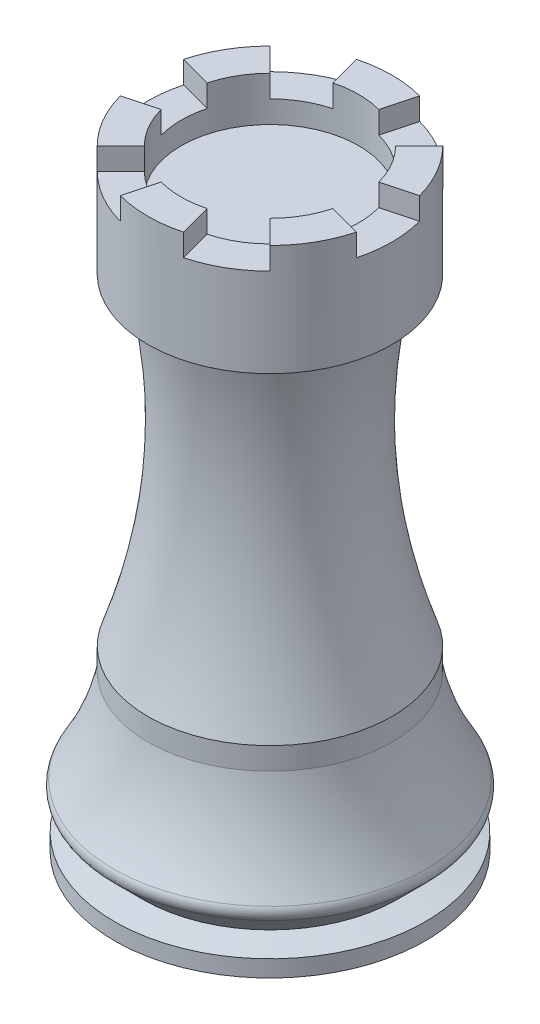
ISO-10303-21;
HEADER;
FILE_DESCRIPTION(('STEP AP214'),'2;1');
FILE_NAME('part.step','',(''),(''),'','','');
FILE_SCHEMA(('AUTOMOTIVE_DESIGN { 1 0 10303 214 1 1 1 1 }'));
ENDSEC;
DATA;
#1=APPLICATION_CONTEXT('core data for automotive mechanical design processes');
#2=APPLICATION_PROTOCOL_DEFINITION('international standard','automotive_design',2000,#1);
#3=PRODUCT_CONTEXT('',#1,'mechanical');
#4=PRODUCT('Part','Part','',(#3));
#5=PRODUCT_RELATED_PRODUCT_CATEGORY('part','',(#4));
#6=PRODUCT_DEFINITION_FORMATION('','',#4);
#7=PRODUCT_DEFINITION_CONTEXT('part definition',#1,'design');
#8=PRODUCT_DEFINITION('design','',#6,#7);
#9=PRODUCT_DEFINITION_SHAPE('','',#8);
#10=(LENGTH_UNIT() NAMED_UNIT(*) SI_UNIT(.MILLI.,.METRE.));
#11=(NAMED_UNIT(*) PLANE_ANGLE_UNIT() SI_UNIT($,.RADIAN.));
#12=(NAMED_UNIT(*) SI_UNIT($,.STERADIAN.) SOLID_ANGLE_UNIT());
#13=UNCERTAINTY_MEASURE_WITH_UNIT(LENGTH_MEASURE(1.E-05),#10,'distance_accuracy_value','');
#14=(GEOMETRIC_REPRESENTATION_CONTEXT(3) GLOBAL_UNCERTAINTY_ASSIGNED_CONTEXT((#13)) GLOBAL_UNIT_ASSIGNED_CONTEXT((#10,
#11,#12)) REPRESENTATION_CONTEXT('',''));
#15=CARTESIAN_POINT('',(0.,0.,0.));
#16=DIRECTION('',(0.,0.,1.));
#17=DIRECTION('',(1.,0.,0.));
#18=AXIS2_PLACEMENT_3D('',#15,#16,#17);
#19=CARTESIAN_POINT('',(0.,55.,0.));
#20=DIRECTION('',(0.,-1.,0.));
#21=DIRECTION('',(1.,0.,0.));
#22=AXIS2_PLACEMENT_3D('',#19,#20,#21);
#23=PLANE('',#22);
#24=DIRECTION('',(-0.707106781186556,0.,0.707106781186539));
#25=VECTOR('',#24,1.);
#26=CARTESIAN_POINT('',(7.77817459305212,55.,-7.77817459305193));
#27=LINE('',#26,#25);
#28=CARTESIAN_POINT('',(7.77817459305212,55.,-7.77817459305193));
#29=VERTEX_POINT('',#28);
#30=CARTESIAN_POINT('',(5.65685424949245,55.,-5.65685424949231));
#31=VERTEX_POINT('',#30);
#32=EDGE_CURVE('E193',#29,#31,#27,.T.);
#33=ORIENTED_EDGE('',*,*,#32,.T.);
#34=CARTESIAN_POINT('',(0.,55.,0.));
#35=DIRECTION('',(0.,1.,0.));
#36=DIRECTION('',(-1.,0.,0.));
#37=AXIS2_PLACEMENT_3D('',#34,#35,#36);
#38=CIRCLE('',#37,8.);
#39=CARTESIAN_POINT('',(7.72740661031254,55.,-2.07055236082017));
#40=VERTEX_POINT('',#39);
#41=EDGE_CURVE('E307',#40,#31,#38,.T.);
#42=ORIENTED_EDGE('',*,*,#41,.F.);
#43=DIRECTION('',(-0.965925826289068,0.,0.258819045102521));
#44=VECTOR('',#43,1.);
#45=CARTESIAN_POINT('',(10.6251840891797,55.,-2.84700949612773));
#46=LINE('',#45,#44);
#47=CARTESIAN_POINT('',(10.6251840891797,55.,-2.84700949612773));
#48=VERTEX_POINT('',#47);
#49=EDGE_CURVE('E216',#48,#40,#46,.T.);
#50=ORIENTED_EDGE('',*,*,#49,.F.);
#51=CARTESIAN_POINT('',(0.,55.,0.));
#52=DIRECTION('',(0.,1.,0.));
#53=DIRECTION('',(-1.,0.,0.));
#54=AXIS2_PLACEMENT_3D('',#51,#52,#53);
#55=CIRCLE('',#54,11.);
#56=EDGE_CURVE('E211',#48,#29,#55,.T.);
#57=ORIENTED_EDGE('',*,*,#56,.T.);
#58=EDGE_LOOP('',(#33,#42,#50,#57));
#59=FACE_BOUND('',#58,.T.);
#60=ADVANCED_FACE('F33',(#59),#23,.F.);
#61=CARTESIAN_POINT('',(2.07055236082025,55.,-7.72740661031252));
#62=VERTEX_POINT('',#61);
#63=CARTESIAN_POINT('',(-2.07055236082009,55.,-7.72740661031257));
#64=VERTEX_POINT('',#63);
#65=EDGE_CURVE('E300',#62,#64,#38,.T.);
#66=ORIENTED_EDGE('',*,*,#65,.F.);
#67=DIRECTION('',(-0.258819045102532,0.,0.965925826289065));
#68=VECTOR('',#67,1.);
#69=CARTESIAN_POINT('',(2.84700949612785,55.,-10.6251840891797));
#70=LINE('',#69,#68);
#71=CARTESIAN_POINT('',(2.84700949612785,55.,-10.6251840891797));
#72=VERTEX_POINT('',#71);
#73=EDGE_CURVE('E301',#72,#62,#70,.T.);
#74=ORIENTED_EDGE('',*,*,#73,.F.);
#75=CARTESIAN_POINT('',(-2.84700949612762,55.,-10.6251840891798));
#76=VERTEX_POINT('',#75);
#77=EDGE_CURVE('E217',#72,#76,#55,.T.);
#78=ORIENTED_EDGE('',*,*,#77,.T.);
#79=DIRECTION('',(0.258819045102511,0.,0.965925826289071));
#80=VECTOR('',#79,1.);
#81=CARTESIAN_POINT('',(-2.84700949612762,55.,-10.6251840891798));
#82=LINE('',#81,#80);
#83=EDGE_CURVE('E303',#76,#64,#82,.T.);
#84=ORIENTED_EDGE('',*,*,#83,.T.);
#85=EDGE_LOOP('',(#66,#74,#78,#84));
#86=FACE_BOUND('',#85,.T.);
#87=ADVANCED_FACE('F287',(#86),#23,.F.);
#88=CARTESIAN_POINT('',(-5.65685424949233,55.,-5.65685424949243));
#89=VERTEX_POINT('',#88);
#90=CARTESIAN_POINT('',(-7.72740661031255,55.,-2.07055236082017));
#91=VERTEX_POINT('',#90);
#92=EDGE_CURVE('E308',#89,#91,#38,.T.);
#93=ORIENTED_EDGE('',*,*,#92,.F.);
#94=DIRECTION('',(0.707106781186541,0.,0.707106781186554));
#95=VECTOR('',#94,1.);
#96=CARTESIAN_POINT('',(-7.77817459305195,55.,-7.77817459305209));
#97=LINE('',#96,#95);
#98=CARTESIAN_POINT('',(-7.77817459305195,55.,-7.77817459305209));
#99=VERTEX_POINT('',#98);
#100=EDGE_CURVE('E426',#99,#89,#97,.T.);
#101=ORIENTED_EDGE('',*,*,#100,.F.);
#102=CARTESIAN_POINT('',(-10.6251840891797,55.,-2.84700949612773));
#103=VERTEX_POINT('',#102);
#104=EDGE_CURVE('E221',#99,#103,#55,.T.);
#105=ORIENTED_EDGE('',*,*,#104,.T.);
#106=DIRECTION('',(0.965925826289068,0.,0.258819045102521));
#107=VECTOR('',#106,1.);
#108=CARTESIAN_POINT('',(-10.6251840891797,55.,-2.84700949612773));
#109=LINE('',#108,#107);
#110=EDGE_CURVE('E410',#103,#91,#109,.T.);
#111=ORIENTED_EDGE('',*,*,#110,.T.);
#112=EDGE_LOOP('',(#93,#101,#105,#111));
#113=FACE_BOUND('',#112,.T.);
#114=ADVANCED_FACE('F291',(#113),#23,.F.);
#115=CARTESIAN_POINT('',(-7.72740661031255,55.,2.07055236082017));
#116=VERTEX_POINT('',#115);
#117=CARTESIAN_POINT('',(-5.65685424949241,55.,5.65685424949235));
#118=VERTEX_POINT('',#117);
#119=EDGE_CURVE('E310',#116,#118,#38,.T.);
#120=ORIENTED_EDGE('',*,*,#119,.F.);
#121=DIRECTION('',(0.965925826289068,0.,-0.258819045102521));
#122=VECTOR('',#121,1.);
#123=CARTESIAN_POINT('',(-10.6251840891797,55.,2.84700949612773));
#124=LINE('',#123,#122);
#125=CARTESIAN_POINT('',(-10.6251840891797,55.,2.84700949612773));
#126=VERTEX_POINT('',#125);
#127=EDGE_CURVE('E401',#126,#116,#124,.T.);
#128=ORIENTED_EDGE('',*,*,#127,.F.);
#129=CARTESIAN_POINT('',(-7.77817459305206,55.,7.77817459305198));
#130=VERTEX_POINT('',#129);
#131=EDGE_CURVE('E230',#126,#130,#55,.T.);
#132=ORIENTED_EDGE('',*,*,#131,.T.);
#133=DIRECTION('',(0.707106781186551,0.,-0.707106781186544));
#134=VECTOR('',#133,1.);
#135=CARTESIAN_POINT('',(-7.77817459305206,55.,7.77817459305198));
#136=LINE('',#135,#134);
#137=EDGE_CURVE('E384',#130,#118,#136,.T.);
#138=ORIENTED_EDGE('',*,*,#137,.T.);
#139=EDGE_LOOP('',(#120,#128,#132,#138));
#140=FACE_BOUND('',#139,.T.);
#141=ADVANCED_FACE('F283',(#140),#23,.F.);
#142=CARTESIAN_POINT('',(-2.0705523608202,55.,7.72740661031254));
#143=VERTEX_POINT('',#142);
#144=CARTESIAN_POINT('',(2.07055236082014,55.,7.72740661031255));
#145=VERTEX_POINT('',#144);
#146=EDGE_CURVE('E464',#143,#145,#38,.T.);
#147=ORIENTED_EDGE('',*,*,#146,.F.);
#148=DIRECTION('',(0.258819045102525,0.,-0.965925826289067));
#149=VECTOR('',#148,1.);
#150=CARTESIAN_POINT('',(-2.84700949612777,55.,10.6251840891797));
#151=LINE('',#150,#149);
#152=CARTESIAN_POINT('',(-2.84700949612777,55.,10.6251840891797));
#153=VERTEX_POINT('',#152);
#154=EDGE_CURVE('E375',#153,#143,#151,.T.);
#155=ORIENTED_EDGE('',*,*,#154,.F.);
#156=CARTESIAN_POINT('',(2.8470094961277,55.,10.6251840891798));
#157=VERTEX_POINT('',#156);
#158=EDGE_CURVE('E223',#153,#157,#55,.T.);
#159=ORIENTED_EDGE('',*,*,#158,.T.);
#160=DIRECTION('',(-0.258819045102518,0.,-0.965925826289069));
#161=VECTOR('',#160,1.);
#162=CARTESIAN_POINT('',(2.8470094961277,55.,10.6251840891798));
#163=LINE('',#162,#161);
#164=EDGE_CURVE('E358',#157,#145,#163,.T.);
#165=ORIENTED_EDGE('',*,*,#164,.T.);
#166=EDGE_LOOP('',(#147,#155,#159,#165));
#167=FACE_BOUND('',#166,.T.);
#168=ADVANCED_FACE('F279',(#167),#23,.F.);
#169=CARTESIAN_POINT('',(5.65685424949237,55.,5.65685424949239));
#170=VERTEX_POINT('',#169);
#171=CARTESIAN_POINT('',(7.72740661031254,55.,2.07055236082017));
#172=VERTEX_POINT('',#171);
#173=EDGE_CURVE('E309',#170,#172,#38,.T.);
#174=ORIENTED_EDGE('',*,*,#173,.F.);
#175=DIRECTION('',(-0.707106781186546,0.,-0.707106781186549));
#176=VECTOR('',#175,1.);
#177=CARTESIAN_POINT('',(7.77817459305201,55.,7.77817459305203));
#178=LINE('',#177,#176);
#179=CARTESIAN_POINT('',(7.77817459305201,55.,7.77817459305203));
#180=VERTEX_POINT('',#179);
#181=EDGE_CURVE('E349',#180,#170,#178,.T.);
#182=ORIENTED_EDGE('',*,*,#181,.F.);
#183=CARTESIAN_POINT('',(10.6251840891797,55.,2.84700949612773));
#184=VERTEX_POINT('',#183);
#185=EDGE_CURVE('E219',#180,#184,#55,.T.);
#186=ORIENTED_EDGE('',*,*,#185,.T.);
#187=DIRECTION('',(-0.965925826289068,0.,-0.258819045102521));
#188=VECTOR('',#187,1.);
#189=CARTESIAN_POINT('',(10.6251840891797,55.,2.84700949612773));
#190=LINE('',#189,#188);
#191=EDGE_CURVE('E333',#184,#172,#190,.T.);
#192=ORIENTED_EDGE('',*,*,#191,.T.);
#193=EDGE_LOOP('',(#174,#182,#186,#192));
#194=FACE_BOUND('',#193,.T.);
#195=ADVANCED_FACE('F277',(#194),#23,.F.);
#196=CARTESIAN_POINT('',(0.,55.,0.));
#197=DIRECTION('',(0.,1.,0.));
#198=DIRECTION('',(-1.,0.,0.));
#199=AXIS2_PLACEMENT_3D('',#196,#197,#198);
#200=CYLINDRICAL_SURFACE('',#199,11.);
#201=ORIENTED_EDGE('',*,*,#77,.F.);
#202=DIRECTION('',(0.,1.,0.));
#203=VECTOR('',#202,1.);
#204=CARTESIAN_POINT('',(2.84700949612785,55.,-10.6251840891797));
#205=LINE('',#204,#203);
#206=CARTESIAN_POINT('',(2.84700949612785,53.,-10.6251840891797));
#207=VERTEX_POINT('',#206);
#208=EDGE_CURVE('E446',#207,#72,#205,.T.);
#209=ORIENTED_EDGE('',*,*,#208,.F.);
#210=CARTESIAN_POINT('',(0.,53.,0.));
#211=DIRECTION('',(0.,-1.,0.));
#212=DIRECTION('',(-0.866025403784433,0.,-0.50000000000001));
#213=AXIS2_PLACEMENT_3D('',#210,#211,#212);
#214=CIRCLE('',#213,11.);
#215=CARTESIAN_POINT('',(7.77817459305212,53.,-7.77817459305193));
#216=VERTEX_POINT('',#215);
#217=EDGE_CURVE('E213',#207,#216,#214,.T.);
#218=ORIENTED_EDGE('',*,*,#217,.T.);
#219=DIRECTION('',(0.,1.,0.));
#220=VECTOR('',#219,1.);
#221=CARTESIAN_POINT('',(7.77817459305212,55.,-7.77817459305193));
#222=LINE('',#221,#220);
#223=EDGE_CURVE('E196',#216,#29,#222,.T.);
#224=ORIENTED_EDGE('',*,*,#223,.T.);
#225=ORIENTED_EDGE('',*,*,#56,.F.);
#226=DIRECTION('',(0.,1.,0.));
#227=VECTOR('',#226,1.);
#228=CARTESIAN_POINT('',(10.6251840891797,55.,-2.84700949612773));
#229=LINE('',#228,#227);
#230=CARTESIAN_POINT('',(10.6251840891797,53.,-2.84700949612773));
#231=VERTEX_POINT('',#230);
#232=EDGE_CURVE('E326',#231,#48,#229,.T.);
#233=ORIENTED_EDGE('',*,*,#232,.F.);
#234=CARTESIAN_POINT('',(0.,53.,0.));
#235=DIRECTION('',(0.,-1.,0.));
#236=DIRECTION('',(0.,0.,-1.));
#237=AXIS2_PLACEMENT_3D('',#234,#235,#236);
#238=CIRCLE('',#237,11.);
#239=CARTESIAN_POINT('',(10.6251840891797,53.,2.84700949612773));
#240=VERTEX_POINT('',#239);
#241=EDGE_CURVE('E314',#231,#240,#238,.T.);
#242=ORIENTED_EDGE('',*,*,#241,.T.);
#243=DIRECTION('',(0.,1.,0.));
#244=VECTOR('',#243,1.);
#245=CARTESIAN_POINT('',(10.6251840891797,55.,2.84700949612773));
#246=LINE('',#245,#244);
#247=EDGE_CURVE('E335',#240,#184,#246,.T.);
#248=ORIENTED_EDGE('',*,*,#247,.T.);
#249=ORIENTED_EDGE('',*,*,#185,.F.);
#250=DIRECTION('',(0.,1.,0.));
#251=VECTOR('',#250,1.);
#252=CARTESIAN_POINT('',(7.77817459305201,55.,7.77817459305203));
#253=LINE('',#252,#251);
#254=CARTESIAN_POINT('',(7.77817459305201,53.,7.77817459305203));
#255=VERTEX_POINT('',#254);
#256=EDGE_CURVE('E351',#255,#180,#253,.T.);
#257=ORIENTED_EDGE('',*,*,#256,.F.);
#258=CARTESIAN_POINT('',(0.,53.,0.));
#259=DIRECTION('',(0.,-1.,0.));
#260=DIRECTION('',(0.86602540378444,0.,-0.499999999999998));
#261=AXIS2_PLACEMENT_3D('',#258,#259,#260);
#262=CIRCLE('',#261,11.);
#263=CARTESIAN_POINT('',(2.8470094961277,53.,10.6251840891798));
#264=VERTEX_POINT('',#263);
#265=EDGE_CURVE('E338',#255,#264,#262,.T.);
#266=ORIENTED_EDGE('',*,*,#265,.T.);
#267=DIRECTION('',(0.,1.,0.));
#268=VECTOR('',#267,1.);
#269=CARTESIAN_POINT('',(2.8470094961277,55.,10.6251840891798));
#270=LINE('',#269,#268);
#271=EDGE_CURVE('E361',#264,#157,#270,.T.);
#272=ORIENTED_EDGE('',*,*,#271,.T.);
#273=ORIENTED_EDGE('',*,*,#158,.F.);
#274=DIRECTION('',(0.,1.,0.));
#275=VECTOR('',#274,1.);
#276=CARTESIAN_POINT('',(-2.84700949612777,55.,10.6251840891797));
#277=LINE('',#276,#275);
#278=CARTESIAN_POINT('',(-2.84700949612777,53.,10.6251840891797));
#279=VERTEX_POINT('',#278);
#280=EDGE_CURVE('E377',#279,#153,#277,.T.);
#281=ORIENTED_EDGE('',*,*,#280,.F.);
#282=CARTESIAN_POINT('',(0.,53.,0.));
#283=DIRECTION('',(0.,-1.,0.));
#284=DIRECTION('',(0.866025403784436,0.,0.500000000000004));
#285=AXIS2_PLACEMENT_3D('',#282,#283,#284);
#286=CIRCLE('',#285,11.);
#287=CARTESIAN_POINT('',(-7.77817459305206,53.,7.77817459305198));
#288=VERTEX_POINT('',#287);
#289=EDGE_CURVE('E364',#279,#288,#286,.T.);
#290=ORIENTED_EDGE('',*,*,#289,.T.);
#291=DIRECTION('',(0.,1.,0.));
#292=VECTOR('',#291,1.);
#293=CARTESIAN_POINT('',(-7.77817459305206,55.,7.77817459305198));
#294=LINE('',#293,#292);
#295=EDGE_CURVE('E387',#288,#130,#294,.T.);
#296=ORIENTED_EDGE('',*,*,#295,.T.);
#297=ORIENTED_EDGE('',*,*,#131,.F.);
#298=DIRECTION('',(0.,1.,0.));
#299=VECTOR('',#298,1.);
#300=CARTESIAN_POINT('',(-10.6251840891797,55.,2.84700949612773));
#301=LINE('',#300,#299);
#302=CARTESIAN_POINT('',(-10.6251840891797,53.,2.84700949612773));
#303=VERTEX_POINT('',#302);
#304=EDGE_CURVE('E403',#303,#126,#301,.T.);
#305=ORIENTED_EDGE('',*,*,#304,.F.);
#306=CARTESIAN_POINT('',(0.,53.,0.));
#307=DIRECTION('',(0.,-1.,0.));
#308=DIRECTION('',(0.,0.,1.));
#309=AXIS2_PLACEMENT_3D('',#306,#307,#308);
#310=CIRCLE('',#309,11.);
#311=CARTESIAN_POINT('',(-10.6251840891797,53.,-2.84700949612773));
#312=VERTEX_POINT('',#311);
#313=EDGE_CURVE('E390',#303,#312,#310,.T.);
#314=ORIENTED_EDGE('',*,*,#313,.T.);
#315=DIRECTION('',(0.,1.,0.));
#316=VECTOR('',#315,1.);
#317=CARTESIAN_POINT('',(-10.6251840891797,55.,-2.84700949612773));
#318=LINE('',#317,#316);
#319=EDGE_CURVE('E413',#312,#103,#318,.T.);
#320=ORIENTED_EDGE('',*,*,#319,.T.);
#321=ORIENTED_EDGE('',*,*,#104,.F.);
#322=DIRECTION('',(0.,1.,0.));
#323=VECTOR('',#322,1.);
#324=CARTESIAN_POINT('',(-7.77817459305195,55.,-7.77817459305209));
#325=LINE('',#324,#323);
#326=CARTESIAN_POINT('',(-7.77817459305195,53.,-7.77817459305209));
#327=VERTEX_POINT('',#326);
#328=EDGE_CURVE('E428',#327,#99,#325,.T.);
#329=ORIENTED_EDGE('',*,*,#328,.F.);
#330=CARTESIAN_POINT('',(0.,53.,0.));
#331=DIRECTION('',(0.,-1.,0.));
#332=DIRECTION('',(-0.866025403784443,0.,0.499999999999992));
#333=AXIS2_PLACEMENT_3D('',#330,#331,#332);
#334=CIRCLE('',#333,11.);
#335=CARTESIAN_POINT('',(-2.84700949612762,53.,-10.6251840891798));
#336=VERTEX_POINT('',#335);
#337=EDGE_CURVE('E416',#327,#336,#334,.T.);
#338=ORIENTED_EDGE('',*,*,#337,.T.);
#339=DIRECTION('',(0.,1.,0.));
#340=VECTOR('',#339,1.);
#341=CARTESIAN_POINT('',(-2.84700949612762,55.,-10.6251840891798));
#342=LINE('',#341,#340);
#343=EDGE_CURVE('E434',#336,#76,#342,.T.);
#344=ORIENTED_EDGE('',*,*,#343,.T.);
#345=EDGE_LOOP('',(#201,#209,#218,#224,#225,#233,#242,#248,#249,#257,#266,#272,#273,#281,#290,
#296,#297,#305,#314,#320,#321,#329,#338,#344));
#346=FACE_BOUND('',#345,.T.);
#347=CARTESIAN_POINT('',(0.,45.,0.));
#348=DIRECTION('',(0.,1.,0.));
#349=DIRECTION('',(-1.,0.,0.));
#350=AXIS2_PLACEMENT_3D('',#347,#348,#349);
#351=CIRCLE('',#350,11.);
#352=CARTESIAN_POINT('',(-11.,45.,0.));
#353=VERTEX_POINT('',#352);
#354=EDGE_CURVE('E224',#353,#353,#351,.T.);
#355=ORIENTED_EDGE('',*,*,#354,.T.);
#356=EDGE_LOOP('',(#355));
#357=FACE_BOUND('',#356,.T.);
#358=ADVANCED_FACE('F208',(#346,#357),#200,.T.);
#359=CARTESIAN_POINT('',(0.,44.,0.));
#360=DIRECTION('',(0.,1.,0.));
#361=DIRECTION('',(-1.,0.,0.));
#362=AXIS2_PLACEMENT_3D('',#359,#360,#361);
#363=CONICAL_SURFACE('',#362,9.,1.10714871779409);
#364=ORIENTED_EDGE('',*,*,#354,.F.);
#365=EDGE_LOOP('',(#364));
#366=FACE_BOUND('',#365,.T.);
#367=CARTESIAN_POINT('',(0.,44.,0.));
#368=DIRECTION('',(0.,1.,0.));
#369=DIRECTION('',(-1.,0.,0.));
#370=AXIS2_PLACEMENT_3D('',#367,#368,#369);
#371=CIRCLE('',#370,9.);
#372=CARTESIAN_POINT('',(-9.,44.,0.));
#373=VERTEX_POINT('',#372);
#374=EDGE_CURVE('E232',#373,#373,#371,.T.);
#375=ORIENTED_EDGE('',*,*,#374,.T.);
#376=EDGE_LOOP('',(#375));
#377=FACE_BOUND('',#376,.T.);
#378=ADVANCED_FACE('F270',(#366,#377),#363,.T.);
#379=CARTESIAN_POINT('',(11.,16.,0.));
#380=CARTESIAN_POINT('',(6.11915337363332,30.1600712777124,0.));
#381=CARTESIAN_POINT('',(9.,44.,0.));
#382=B_SPLINE_CURVE_WITH_KNOTS('',2,(#379,#380,#381),.UNSPECIFIED.,.F.,.F.,(3,3),(0.,1.),.UNSPECIFIED.);
#383=CARTESIAN_POINT('',(0.,55.,0.));
#384=DIRECTION('',(0.,1.,0.));
#385=AXIS1_PLACEMENT('',#383,#384);
#386=SURFACE_OF_REVOLUTION('',#382,#385);
#387=ORIENTED_EDGE('',*,*,#374,.F.);
#388=EDGE_LOOP('',(#387));
#389=FACE_BOUND('',#388,.T.);
#390=CARTESIAN_POINT('',(0.,16.,0.));
#391=DIRECTION('',(0.,1.,0.));
#392=DIRECTION('',(-1.,0.,0.));
#393=AXIS2_PLACEMENT_3D('',#390,#391,#392);
#394=CIRCLE('',#393,11.);
#395=CARTESIAN_POINT('',(-11.,16.,0.));
#396=VERTEX_POINT('',#395);
#397=EDGE_CURVE('E235',#396,#396,#394,.T.);
#398=ORIENTED_EDGE('',*,*,#397,.T.);
#399=EDGE_LOOP('',(#398));
#400=FACE_BOUND('',#399,.T.);
#401=ADVANCED_FACE('F265',(#389,#400),#386,.T.);
#402=CARTESIAN_POINT('',(0.,55.,0.));
#403=DIRECTION('',(0.,1.,0.));
#404=DIRECTION('',(-1.,0.,0.));
#405=AXIS2_PLACEMENT_3D('',#402,#403,#404);
#406=CYLINDRICAL_SURFACE('',#405,11.);
#407=ORIENTED_EDGE('',*,*,#397,.F.);
#408=EDGE_LOOP('',(#407));
#409=FACE_BOUND('',#408,.T.);
#410=CARTESIAN_POINT('',(0.,14.,0.));
#411=DIRECTION('',(0.,1.,0.));
#412=DIRECTION('',(-1.,0.,0.));
#413=AXIS2_PLACEMENT_3D('',#410,#411,#412);
#414=CIRCLE('',#413,11.);
#415=CARTESIAN_POINT('',(-11.,14.,0.));
#416=VERTEX_POINT('',#415);
#417=EDGE_CURVE('E240',#416,#416,#414,.T.);
#418=ORIENTED_EDGE('',*,*,#417,.T.);
#419=EDGE_LOOP('',(#418));
#420=FACE_BOUND('',#419,.T.);
#421=ADVANCED_FACE('F269',(#409,#420),#406,.T.);
#422=CARTESIAN_POINT('',(14.5,5.,0.));
#423=CARTESIAN_POINT('',(11.8688971181247,9.1496313389872,0.));
#424=CARTESIAN_POINT('',(11.,14.,0.));
#425=B_SPLINE_CURVE_WITH_KNOTS('',2,(#422,#423,#424),.UNSPECIFIED.,.F.,.F.,(3,3),(0.,1.),.UNSPECIFIED.);
#426=CARTESIAN_POINT('',(0.,55.,0.));
#427=DIRECTION('',(0.,1.,0.));
#428=AXIS1_PLACEMENT('',#426,#427);
#429=SURFACE_OF_REVOLUTION('',#425,#428);
#430=CARTESIAN_POINT('',(0.,5.65941289420462,0.));
#431=DIRECTION('',(0.,1.,0.));
#432=DIRECTION('',(-1.,0.,0.));
#433=AXIS2_PLACEMENT_3D('',#430,#431,#432);
#434=CIRCLE('',#433,14.0956405231006);
#435=CARTESIAN_POINT('',(-14.0956405231006,5.65941289420462,0.));
#436=VERTEX_POINT('',#435);
#437=EDGE_CURVE('E41',#436,#436,#434,.T.);
#438=ORIENTED_EDGE('',*,*,#437,.T.);
#439=EDGE_LOOP('',(#438));
#440=FACE_BOUND('',#439,.T.);
#441=ORIENTED_EDGE('',*,*,#417,.F.);
#442=EDGE_LOOP('',(#441));
#443=FACE_BOUND('',#442,.T.);
#444=ADVANCED_FACE('F555',(#440,#443),#429,.T.);
#445=CARTESIAN_POINT('',(0.,1.94968869268542,0.));
#446=DIRECTION('',(0.,1.,0.));
#447=DIRECTION('',(-1.,0.,0.));
#448=AXIS2_PLACEMENT_3D('',#445,#446,#447);
#449=CONICAL_SURFACE('',#448,11.4496886926854,0.785398163397447);
#450=CARTESIAN_POINT('',(0.,4.44247361372824,0.));
#451=DIRECTION('',(0.,-1.,0.));
#452=DIRECTION('',(1.,0.,0.));
#453=AXIS2_PLACEMENT_3D('',#450,#451,#452);
#454=CIRCLE('',#453,13.9424736137282);
#455=CARTESIAN_POINT('',(13.9424736137282,4.44247361372824,0.));
#456=VERTEX_POINT('',#455);
#457=EDGE_CURVE('E11',#456,#456,#454,.T.);
#458=ORIENTED_EDGE('',*,*,#457,.T.);
#459=EDGE_LOOP('',(#458));
#460=FACE_BOUND('',#459,.T.);
#461=CARTESIAN_POINT('',(0.,1.94968869268542,0.));
#462=DIRECTION('',(0.,1.,0.));
#463=DIRECTION('',(-1.,0.,0.));
#464=AXIS2_PLACEMENT_3D('',#461,#462,#463);
#465=CIRCLE('',#464,11.4496886926854);
#466=CARTESIAN_POINT('',(-11.4496886926854,1.94968869268542,0.));
#467=VERTEX_POINT('',#466);
#468=EDGE_CURVE('E243',#467,#467,#465,.T.);
#469=ORIENTED_EDGE('',*,*,#468,.T.);
#470=EDGE_LOOP('',(#469));
#471=FACE_BOUND('',#470,.T.);
#472=ADVANCED_FACE('F552',(#460,#471),#449,.T.);
#473=CARTESIAN_POINT('',(0.,1.5,0.));
#474=DIRECTION('',(0.,-1.,0.));
#475=DIRECTION('',(1.,0.,0.));
#476=AXIS2_PLACEMENT_3D('',#473,#474,#475);
#477=CONICAL_SURFACE('',#476,14.,1.39626340159547);
#478=ORIENTED_EDGE('',*,*,#468,.F.);
#479=EDGE_LOOP('',(#478));
#480=FACE_BOUND('',#479,.T.);
#481=CARTESIAN_POINT('',(0.,1.5,0.));
#482=DIRECTION('',(0.,1.,0.));
#483=DIRECTION('',(-1.,0.,0.));
#484=AXIS2_PLACEMENT_3D('',#481,#482,#483);
#485=CIRCLE('',#484,14.);
#486=CARTESIAN_POINT('',(-14.,1.5,0.));
#487=VERTEX_POINT('',#486);
#488=EDGE_CURVE('E246',#487,#487,#485,.T.);
#489=ORIENTED_EDGE('',*,*,#488,.T.);
#490=EDGE_LOOP('',(#489));
#491=FACE_BOUND('',#490,.T.);
#492=ADVANCED_FACE('F548',(#480,#491),#477,.T.);
#493=CARTESIAN_POINT('',(0.,55.,0.));
#494=DIRECTION('',(0.,1.,0.));
#495=DIRECTION('',(-1.,0.,0.));
#496=AXIS2_PLACEMENT_3D('',#493,#494,#495);
#497=CYLINDRICAL_SURFACE('',#496,14.);
#498=ORIENTED_EDGE('',*,*,#488,.F.);
#499=EDGE_LOOP('',(#498));
#500=FACE_BOUND('',#499,.T.);
#501=CARTESIAN_POINT('',(0.,0.,0.));
#502=DIRECTION('',(0.,1.,0.));
#503=DIRECTION('',(-1.,0.,0.));
#504=AXIS2_PLACEMENT_3D('',#501,#502,#503);
#505=CIRCLE('',#504,14.);
#506=CARTESIAN_POINT('',(-14.,0.,0.));
#507=VERTEX_POINT('',#506);
#508=EDGE_CURVE('E249',#507,#507,#505,.T.);
#509=ORIENTED_EDGE('',*,*,#508,.T.);
#510=EDGE_LOOP('',(#509));
#511=FACE_BOUND('',#510,.T.);
#512=ADVANCED_FACE('F544',(#500,#511),#497,.T.);
#513=CARTESIAN_POINT('',(0.,0.,0.));
#514=DIRECTION('',(0.,1.,0.));
#515=DIRECTION('',(-1.,0.,0.));
#516=AXIS2_PLACEMENT_3D('',#513,#514,#515);
#517=PLANE('',#516);
#518=ORIENTED_EDGE('',*,*,#508,.F.);
#519=EDGE_LOOP('',(#518));
#520=FACE_BOUND('',#519,.T.);
#521=ADVANCED_FACE('F541',(#520),#517,.F.);
#522=CARTESIAN_POINT('',(0.,5.14958039491478,0.));
#523=DIRECTION('',(0.,-1.,0.));
#524=DIRECTION('',(1.,0.,0.));
#525=AXIS2_PLACEMENT_3D('',#522,#523,#524);
#526=TOROIDAL_SURFACE('',#525,13.2353668325417,1.);
#527=ORIENTED_EDGE('',*,*,#457,.F.);
#528=EDGE_LOOP('',(#527));
#529=FACE_BOUND('',#528,.T.);
#530=ORIENTED_EDGE('',*,*,#437,.F.);
#531=EDGE_LOOP('',(#530));
#532=FACE_BOUND('',#531,.T.);
#533=ADVANCED_FACE('F35',(#529,#532),#526,.T.);
#534=CARTESIAN_POINT('',(0.,51.,0.));
#535=DIRECTION('',(0.,1.,0.));
#536=DIRECTION('',(-1.,0.,0.));
#537=AXIS2_PLACEMENT_3D('',#534,#535,#536);
#538=CYLINDRICAL_SURFACE('',#537,8.);
#539=CARTESIAN_POINT('',(0.,51.,0.));
#540=DIRECTION('',(0.,1.,0.));
#541=DIRECTION('',(-1.,0.,0.));
#542=AXIS2_PLACEMENT_3D('',#539,#540,#541);
#543=CIRCLE('',#542,8.);
#544=CARTESIAN_POINT('',(-8.,51.,0.));
#545=VERTEX_POINT('',#544);
#546=EDGE_CURVE('E252',#545,#545,#543,.T.);
#547=ORIENTED_EDGE('',*,*,#546,.F.);
#548=EDGE_LOOP('',(#547));
#549=FACE_BOUND('',#548,.T.);
#550=CARTESIAN_POINT('',(0.,53.,0.));
#551=DIRECTION('',(0.,-1.,0.));
#552=DIRECTION('',(-0.866025403784433,0.,-0.50000000000001));
#553=AXIS2_PLACEMENT_3D('',#550,#551,#552);
#554=CIRCLE('',#553,8.);
#555=CARTESIAN_POINT('',(2.07055236082025,53.,-7.72740661031252));
#556=VERTEX_POINT('',#555);
#557=CARTESIAN_POINT('',(5.65685424949245,53.,-5.65685424949231));
#558=VERTEX_POINT('',#557);
#559=EDGE_CURVE('E438',#556,#558,#554,.T.);
#560=ORIENTED_EDGE('',*,*,#559,.F.);
#561=DIRECTION('',(0.,-1.,0.));
#562=VECTOR('',#561,1.);
#563=CARTESIAN_POINT('',(2.07055236082025,55.,-7.72740661031252));
#564=LINE('',#563,#562);
#565=EDGE_CURVE('E443',#62,#556,#564,.T.);
#566=ORIENTED_EDGE('',*,*,#565,.F.);
#567=ORIENTED_EDGE('',*,*,#65,.T.);
#568=DIRECTION('',(0.,-1.,0.));
#569=VECTOR('',#568,1.);
#570=CARTESIAN_POINT('',(-2.07055236082009,55.,-7.72740661031257));
#571=LINE('',#570,#569);
#572=CARTESIAN_POINT('',(-2.07055236082009,53.,-7.72740661031257));
#573=VERTEX_POINT('',#572);
#574=EDGE_CURVE('E431',#64,#573,#571,.T.);
#575=ORIENTED_EDGE('',*,*,#574,.T.);
#576=CARTESIAN_POINT('',(0.,53.,0.));
#577=DIRECTION('',(0.,-1.,0.));
#578=DIRECTION('',(-0.866025403784443,0.,0.499999999999992));
#579=AXIS2_PLACEMENT_3D('',#576,#577,#578);
#580=CIRCLE('',#579,8.);
#581=CARTESIAN_POINT('',(-5.65685424949233,53.,-5.65685424949243));
#582=VERTEX_POINT('',#581);
#583=EDGE_CURVE('E419',#582,#573,#580,.T.);
#584=ORIENTED_EDGE('',*,*,#583,.F.);
#585=DIRECTION('',(0.,-1.,0.));
#586=VECTOR('',#585,1.);
#587=CARTESIAN_POINT('',(-5.65685424949233,55.,-5.65685424949243));
#588=LINE('',#587,#586);
#589=EDGE_CURVE('E424',#89,#582,#588,.T.);
#590=ORIENTED_EDGE('',*,*,#589,.F.);
#591=ORIENTED_EDGE('',*,*,#92,.T.);
#592=DIRECTION('',(0.,-1.,0.));
#593=VECTOR('',#592,1.);
#594=CARTESIAN_POINT('',(-7.72740661031255,55.,-2.07055236082017));
#595=LINE('',#594,#593);
#596=CARTESIAN_POINT('',(-7.72740661031255,53.,-2.07055236082017));
#597=VERTEX_POINT('',#596);
#598=EDGE_CURVE('E407',#91,#597,#595,.T.);
#599=ORIENTED_EDGE('',*,*,#598,.T.);
#600=CARTESIAN_POINT('',(0.,53.,0.));
#601=DIRECTION('',(0.,-1.,0.));
#602=DIRECTION('',(0.,0.,1.));
#603=AXIS2_PLACEMENT_3D('',#600,#601,#602);
#604=CIRCLE('',#603,8.);
#605=CARTESIAN_POINT('',(-7.72740661031255,53.,2.07055236082017));
#606=VERTEX_POINT('',#605);
#607=EDGE_CURVE('E393',#606,#597,#604,.T.);
#608=ORIENTED_EDGE('',*,*,#607,.F.);
#609=DIRECTION('',(0.,-1.,0.));
#610=VECTOR('',#609,1.);
#611=CARTESIAN_POINT('',(-7.72740661031255,55.,2.07055236082017));
#612=LINE('',#611,#610);
#613=EDGE_CURVE('E399',#116,#606,#612,.T.);
#614=ORIENTED_EDGE('',*,*,#613,.F.);
#615=ORIENTED_EDGE('',*,*,#119,.T.);
#616=DIRECTION('',(0.,-1.,0.));
#617=VECTOR('',#616,1.);
#618=CARTESIAN_POINT('',(-5.65685424949241,55.,5.65685424949235));
#619=LINE('',#618,#617);
#620=CARTESIAN_POINT('',(-5.65685424949241,53.,5.65685424949235));
#621=VERTEX_POINT('',#620);
#622=EDGE_CURVE('E381',#118,#621,#619,.T.);
#623=ORIENTED_EDGE('',*,*,#622,.T.);
#624=CARTESIAN_POINT('',(0.,53.,0.));
#625=DIRECTION('',(0.,-1.,0.));
#626=DIRECTION('',(0.866025403784436,0.,0.500000000000004));
#627=AXIS2_PLACEMENT_3D('',#624,#625,#626);
#628=CIRCLE('',#627,8.);
#629=CARTESIAN_POINT('',(-2.0705523608202,53.,7.72740661031254));
#630=VERTEX_POINT('',#629);
#631=EDGE_CURVE('E367',#630,#621,#628,.T.);
#632=ORIENTED_EDGE('',*,*,#631,.F.);
#633=DIRECTION('',(0.,-1.,0.));
#634=VECTOR('',#633,1.);
#635=CARTESIAN_POINT('',(-2.0705523608202,55.,7.72740661031254));
#636=LINE('',#635,#634);
#637=EDGE_CURVE('E373',#143,#630,#636,.T.);
#638=ORIENTED_EDGE('',*,*,#637,.F.);
#639=ORIENTED_EDGE('',*,*,#146,.T.);
#640=DIRECTION('',(0.,-1.,0.));
#641=VECTOR('',#640,1.);
#642=CARTESIAN_POINT('',(2.07055236082014,55.,7.72740661031255));
#643=LINE('',#642,#641);
#644=CARTESIAN_POINT('',(2.07055236082014,53.,7.72740661031255));
#645=VERTEX_POINT('',#644);
#646=EDGE_CURVE('E355',#145,#645,#643,.T.);
#647=ORIENTED_EDGE('',*,*,#646,.T.);
#648=CARTESIAN_POINT('',(0.,53.,0.));
#649=DIRECTION('',(0.,-1.,0.));
#650=DIRECTION('',(0.86602540378444,0.,-0.499999999999998));
#651=AXIS2_PLACEMENT_3D('',#648,#649,#650);
#652=CIRCLE('',#651,8.);
#653=CARTESIAN_POINT('',(5.65685424949237,53.,5.65685424949239));
#654=VERTEX_POINT('',#653);
#655=EDGE_CURVE('E341',#654,#645,#652,.T.);
#656=ORIENTED_EDGE('',*,*,#655,.F.);
#657=DIRECTION('',(0.,-1.,0.));
#658=VECTOR('',#657,1.);
#659=CARTESIAN_POINT('',(5.65685424949237,55.,5.65685424949239));
#660=LINE('',#659,#658);
#661=EDGE_CURVE('E347',#170,#654,#660,.T.);
#662=ORIENTED_EDGE('',*,*,#661,.F.);
#663=ORIENTED_EDGE('',*,*,#173,.T.);
#664=DIRECTION('',(0.,-1.,0.));
#665=VECTOR('',#664,1.);
#666=CARTESIAN_POINT('',(7.72740661031254,55.,2.07055236082017));
#667=LINE('',#666,#665);
#668=CARTESIAN_POINT('',(7.72740661031254,53.,2.07055236082017));
#669=VERTEX_POINT('',#668);
#670=EDGE_CURVE('E330',#172,#669,#667,.T.);
#671=ORIENTED_EDGE('',*,*,#670,.T.);
#672=CARTESIAN_POINT('',(0.,53.,0.));
#673=DIRECTION('',(0.,-1.,0.));
#674=DIRECTION('',(0.,0.,-1.));
#675=AXIS2_PLACEMENT_3D('',#672,#673,#674);
#676=CIRCLE('',#675,8.);
#677=CARTESIAN_POINT('',(7.72740661031254,53.,-2.07055236082017));
#678=VERTEX_POINT('',#677);
#679=EDGE_CURVE('E317',#678,#669,#676,.T.);
#680=ORIENTED_EDGE('',*,*,#679,.F.);
#681=DIRECTION('',(0.,-1.,0.));
#682=VECTOR('',#681,1.);
#683=CARTESIAN_POINT('',(7.72740661031254,55.,-2.07055236082017));
#684=LINE('',#683,#682);
#685=EDGE_CURVE('E323',#40,#678,#684,.T.);
#686=ORIENTED_EDGE('',*,*,#685,.F.);
#687=ORIENTED_EDGE('',*,*,#41,.T.);
#688=DIRECTION('',(0.,-1.,0.));
#689=VECTOR('',#688,1.);
#690=CARTESIAN_POINT('',(5.65685424949245,55.,-5.65685424949231));
#691=LINE('',#690,#689);
#692=EDGE_CURVE('E199',#31,#558,#691,.T.);
#693=ORIENTED_EDGE('',*,*,#692,.T.);
#694=EDGE_LOOP('',(#560,#566,#567,#575,#584,#590,#591,#599,#608,#614,#615,#623,#632,#638,#639,
#647,#656,#662,#663,#671,#680,#686,#687,#693));
#695=FACE_BOUND('',#694,.T.);
#696=ADVANCED_FACE('F450',(#549,#695),#538,.F.);
#697=CARTESIAN_POINT('',(0.,51.,0.));
#698=DIRECTION('',(0.,1.,0.));
#699=DIRECTION('',(-1.,0.,0.));
#700=AXIS2_PLACEMENT_3D('',#697,#698,#699);
#701=PLANE('',#700);
#702=ORIENTED_EDGE('',*,*,#546,.T.);
#703=EDGE_LOOP('',(#702));
#704=FACE_BOUND('',#703,.T.);
#705=ADVANCED_FACE('F534',(#704),#701,.T.);
#706=CARTESIAN_POINT('',(10.6251840891797,53.,-2.84700949612773));
#707=DIRECTION('',(0.,-1.,0.));
#708=DIRECTION('',(0.,0.,-1.));
#709=AXIS2_PLACEMENT_3D('',#706,#707,#708);
#710=PLANE('',#709);
#711=ORIENTED_EDGE('',*,*,#679,.T.);
#712=DIRECTION('',(0.965925826289068,0.,0.258819045102521));
#713=VECTOR('',#712,1.);
#714=CARTESIAN_POINT('',(10.6251840891797,53.,2.84700949612773));
#715=LINE('',#714,#713);
#716=EDGE_CURVE('E328',#669,#240,#715,.T.);
#717=ORIENTED_EDGE('',*,*,#716,.T.);
#718=ORIENTED_EDGE('',*,*,#241,.F.);
#719=DIRECTION('',(0.965925826289068,0.,-0.258819045102521));
#720=VECTOR('',#719,1.);
#721=CARTESIAN_POINT('',(10.6251840891797,53.,-2.84700949612773));
#722=LINE('',#721,#720);
#723=EDGE_CURVE('E320',#678,#231,#722,.T.);
#724=ORIENTED_EDGE('',*,*,#723,.F.);
#725=EDGE_LOOP('',(#711,#717,#718,#724));
#726=FACE_BOUND('',#725,.T.);
#727=ADVANCED_FACE('F457',(#726),#710,.F.);
#728=CARTESIAN_POINT('',(0.,0.,0.));
#729=DIRECTION('',(-0.258819045102521,0.,-0.965925826289068));
#730=DIRECTION('',(-0.965925826289068,0.,0.258819045102521));
#731=AXIS2_PLACEMENT_3D('',#728,#729,#730);
#732=PLANE('',#731);
#733=ORIENTED_EDGE('',*,*,#232,.T.);
#734=ORIENTED_EDGE('',*,*,#49,.T.);
#735=ORIENTED_EDGE('',*,*,#685,.T.);
#736=ORIENTED_EDGE('',*,*,#723,.T.);
#737=EDGE_LOOP('',(#733,#734,#735,#736));
#738=FACE_BOUND('',#737,.T.);
#739=ADVANCED_FACE('F455',(#738),#732,.F.);
#740=CARTESIAN_POINT('',(0.,0.,0.));
#741=DIRECTION('',(0.258819045102521,0.,-0.965925826289068));
#742=DIRECTION('',(-0.965925826289068,0.,-0.258819045102521));
#743=AXIS2_PLACEMENT_3D('',#740,#741,#742);
#744=PLANE('',#743);
#745=ORIENTED_EDGE('',*,*,#247,.F.);
#746=ORIENTED_EDGE('',*,*,#716,.F.);
#747=ORIENTED_EDGE('',*,*,#670,.F.);
#748=ORIENTED_EDGE('',*,*,#191,.F.);
#749=EDGE_LOOP('',(#745,#746,#747,#748));
#750=FACE_BOUND('',#749,.T.);
#751=ADVANCED_FACE('F461',(#750),#744,.T.);
#752=CARTESIAN_POINT('',(7.77817459305201,53.,7.77817459305203));
#753=DIRECTION('',(0.,-1.,0.));
#754=DIRECTION('',(0.86602540378444,0.,-0.499999999999998));
#755=AXIS2_PLACEMENT_3D('',#752,#753,#754);
#756=PLANE('',#755);
#757=ORIENTED_EDGE('',*,*,#655,.T.);
#758=DIRECTION('',(0.258819045102518,0.,0.965925826289069));
#759=VECTOR('',#758,1.);
#760=CARTESIAN_POINT('',(2.8470094961277,53.,10.6251840891798));
#761=LINE('',#760,#759);
#762=EDGE_CURVE('E353',#645,#264,#761,.T.);
#763=ORIENTED_EDGE('',*,*,#762,.T.);
#764=ORIENTED_EDGE('',*,*,#265,.F.);
#765=DIRECTION('',(0.707106781186546,0.,0.707106781186549));
#766=VECTOR('',#765,1.);
#767=CARTESIAN_POINT('',(7.77817459305201,53.,7.77817459305203));
#768=LINE('',#767,#766);
#769=EDGE_CURVE('E344',#654,#255,#768,.T.);
#770=ORIENTED_EDGE('',*,*,#769,.F.);
#771=EDGE_LOOP('',(#757,#763,#764,#770));
#772=FACE_BOUND('',#771,.T.);
#773=ADVANCED_FACE('F523',(#772),#756,.F.);
#774=CARTESIAN_POINT('',(0.,0.,0.));
#775=DIRECTION('',(0.707106781186549,0.,-0.707106781186546));
#776=DIRECTION('',(-0.707106781186546,0.,-0.707106781186549));
#777=AXIS2_PLACEMENT_3D('',#774,#775,#776);
#778=PLANE('',#777);
#779=ORIENTED_EDGE('',*,*,#256,.T.);
#780=ORIENTED_EDGE('',*,*,#181,.T.);
#781=ORIENTED_EDGE('',*,*,#661,.T.);
#782=ORIENTED_EDGE('',*,*,#769,.T.);
#783=EDGE_LOOP('',(#779,#780,#781,#782));
#784=FACE_BOUND('',#783,.T.);
#785=ADVANCED_FACE('F519',(#784),#778,.F.);
#786=CARTESIAN_POINT('',(0.,0.,0.));
#787=DIRECTION('',(0.965925826289069,0.,-0.258819045102518));
#788=DIRECTION('',(-0.258819045102518,0.,-0.965925826289069));
#789=AXIS2_PLACEMENT_3D('',#786,#787,#788);
#790=PLANE('',#789);
#791=ORIENTED_EDGE('',*,*,#271,.F.);
#792=ORIENTED_EDGE('',*,*,#762,.F.);
#793=ORIENTED_EDGE('',*,*,#646,.F.);
#794=ORIENTED_EDGE('',*,*,#164,.F.);
#795=EDGE_LOOP('',(#791,#792,#793,#794));
#796=FACE_BOUND('',#795,.T.);
#797=ADVANCED_FACE('F515',(#796),#790,.T.);
#798=CARTESIAN_POINT('',(-2.84700949612777,53.,10.6251840891797));
#799=DIRECTION('',(0.,-1.,0.));
#800=DIRECTION('',(0.866025403784436,0.,0.500000000000004));
#801=AXIS2_PLACEMENT_3D('',#798,#799,#800);
#802=PLANE('',#801);
#803=ORIENTED_EDGE('',*,*,#631,.T.);
#804=DIRECTION('',(-0.707106781186551,0.,0.707106781186544));
#805=VECTOR('',#804,1.);
#806=CARTESIAN_POINT('',(-7.77817459305206,53.,7.77817459305198));
#807=LINE('',#806,#805);
#808=EDGE_CURVE('E379',#621,#288,#807,.T.);
#809=ORIENTED_EDGE('',*,*,#808,.T.);
#810=ORIENTED_EDGE('',*,*,#289,.F.);
#811=DIRECTION('',(-0.258819045102525,0.,0.965925826289067));
#812=VECTOR('',#811,1.);
#813=CARTESIAN_POINT('',(-2.84700949612777,53.,10.6251840891797));
#814=LINE('',#813,#812);
#815=EDGE_CURVE('E370',#630,#279,#814,.T.);
#816=ORIENTED_EDGE('',*,*,#815,.F.);
#817=EDGE_LOOP('',(#803,#809,#810,#816));
#818=FACE_BOUND('',#817,.T.);
#819=ADVANCED_FACE('F511',(#818),#802,.F.);
#820=CARTESIAN_POINT('',(0.,0.,0.));
#821=DIRECTION('',(0.965925826289067,0.,0.258819045102525));
#822=DIRECTION('',(0.258819045102525,0.,-0.965925826289067));
#823=AXIS2_PLACEMENT_3D('',#820,#821,#822);
#824=PLANE('',#823);
#825=ORIENTED_EDGE('',*,*,#280,.T.);
#826=ORIENTED_EDGE('',*,*,#154,.T.);
#827=ORIENTED_EDGE('',*,*,#637,.T.);
#828=ORIENTED_EDGE('',*,*,#815,.T.);
#829=EDGE_LOOP('',(#825,#826,#827,#828));
#830=FACE_BOUND('',#829,.T.);
#831=ADVANCED_FACE('F508',(#830),#824,.F.);
#832=CARTESIAN_POINT('',(0.,0.,0.));
#833=DIRECTION('',(0.707106781186544,0.,0.707106781186551));
#834=DIRECTION('',(0.707106781186551,0.,-0.707106781186544));
#835=AXIS2_PLACEMENT_3D('',#832,#833,#834);
#836=PLANE('',#835);
#837=ORIENTED_EDGE('',*,*,#295,.F.);
#838=ORIENTED_EDGE('',*,*,#808,.F.);
#839=ORIENTED_EDGE('',*,*,#622,.F.);
#840=ORIENTED_EDGE('',*,*,#137,.F.);
#841=EDGE_LOOP('',(#837,#838,#839,#840));
#842=FACE_BOUND('',#841,.T.);
#843=ADVANCED_FACE('F478',(#842),#836,.T.);
#844=CARTESIAN_POINT('',(-10.6251840891797,53.,2.84700949612773));
#845=DIRECTION('',(0.,-1.,0.));
#846=DIRECTION('',(0.,0.,1.));
#847=AXIS2_PLACEMENT_3D('',#844,#845,#846);
#848=PLANE('',#847);
#849=ORIENTED_EDGE('',*,*,#607,.T.);
#850=DIRECTION('',(-0.965925826289068,0.,-0.258819045102521));
#851=VECTOR('',#850,1.);
#852=CARTESIAN_POINT('',(-10.6251840891797,53.,-2.84700949612773));
#853=LINE('',#852,#851);
#854=EDGE_CURVE('E405',#597,#312,#853,.T.);
#855=ORIENTED_EDGE('',*,*,#854,.T.);
#856=ORIENTED_EDGE('',*,*,#313,.F.);
#857=DIRECTION('',(-0.965925826289068,0.,0.258819045102521));
#858=VECTOR('',#857,1.);
#859=CARTESIAN_POINT('',(-10.6251840891797,53.,2.84700949612773));
#860=LINE('',#859,#858);
#861=EDGE_CURVE('E396',#606,#303,#860,.T.);
#862=ORIENTED_EDGE('',*,*,#861,.F.);
#863=EDGE_LOOP('',(#849,#855,#856,#862));
#864=FACE_BOUND('',#863,.T.);
#865=ADVANCED_FACE('F492',(#864),#848,.F.);
#866=CARTESIAN_POINT('',(0.,0.,0.));
#867=DIRECTION('',(0.258819045102521,0.,0.965925826289068));
#868=DIRECTION('',(0.965925826289068,0.,-0.258819045102521));
#869=AXIS2_PLACEMENT_3D('',#866,#867,#868);
#870=PLANE('',#869);
#871=ORIENTED_EDGE('',*,*,#304,.T.);
#872=ORIENTED_EDGE('',*,*,#127,.T.);
#873=ORIENTED_EDGE('',*,*,#613,.T.);
#874=ORIENTED_EDGE('',*,*,#861,.T.);
#875=EDGE_LOOP('',(#871,#872,#873,#874));
#876=FACE_BOUND('',#875,.T.);
#877=ADVANCED_FACE('F494',(#876),#870,.F.);
#878=CARTESIAN_POINT('',(0.,0.,0.));
#879=DIRECTION('',(-0.258819045102521,0.,0.965925826289068));
#880=DIRECTION('',(0.965925826289068,0.,0.258819045102521));
#881=AXIS2_PLACEMENT_3D('',#878,#879,#880);
#882=PLANE('',#881);
#883=ORIENTED_EDGE('',*,*,#319,.F.);
#884=ORIENTED_EDGE('',*,*,#854,.F.);
#885=ORIENTED_EDGE('',*,*,#598,.F.);
#886=ORIENTED_EDGE('',*,*,#110,.F.);
#887=EDGE_LOOP('',(#883,#884,#885,#886));
#888=FACE_BOUND('',#887,.T.);
#889=ADVANCED_FACE('F489',(#888),#882,.T.);
#890=CARTESIAN_POINT('',(-7.77817459305195,53.,-7.77817459305209));
#891=DIRECTION('',(0.,-1.,0.));
#892=DIRECTION('',(-0.866025403784443,0.,0.499999999999992));
#893=AXIS2_PLACEMENT_3D('',#890,#891,#892);
#894=PLANE('',#893);
#895=ORIENTED_EDGE('',*,*,#583,.T.);
#896=DIRECTION('',(-0.258819045102511,0.,-0.965925826289071));
#897=VECTOR('',#896,1.);
#898=CARTESIAN_POINT('',(-2.84700949612762,53.,-10.6251840891798));
#899=LINE('',#898,#897);
#900=EDGE_CURVE('E56',#573,#336,#899,.T.);
#901=ORIENTED_EDGE('',*,*,#900,.T.);
#902=ORIENTED_EDGE('',*,*,#337,.F.);
#903=DIRECTION('',(-0.707106781186541,0.,-0.707106781186554));
#904=VECTOR('',#903,1.);
#905=CARTESIAN_POINT('',(-7.77817459305195,53.,-7.77817459305209));
#906=LINE('',#905,#904);
#907=EDGE_CURVE('E421',#582,#327,#906,.T.);
#908=ORIENTED_EDGE('',*,*,#907,.F.);
#909=EDGE_LOOP('',(#895,#901,#902,#908));
#910=FACE_BOUND('',#909,.T.);
#911=ADVANCED_FACE('F501',(#910),#894,.F.);
#912=CARTESIAN_POINT('',(0.,0.,0.));
#913=DIRECTION('',(-0.707106781186554,0.,0.707106781186541));
#914=DIRECTION('',(0.707106781186541,0.,0.707106781186554));
#915=AXIS2_PLACEMENT_3D('',#912,#913,#914);
#916=PLANE('',#915);
#917=ORIENTED_EDGE('',*,*,#328,.T.);
#918=ORIENTED_EDGE('',*,*,#100,.T.);
#919=ORIENTED_EDGE('',*,*,#589,.T.);
#920=ORIENTED_EDGE('',*,*,#907,.T.);
#921=EDGE_LOOP('',(#917,#918,#919,#920));
#922=FACE_BOUND('',#921,.T.);
#923=ADVANCED_FACE('F650',(#922),#916,.F.);
#924=CARTESIAN_POINT('',(0.,0.,0.));
#925=DIRECTION('',(-0.965925826289071,0.,0.258819045102511));
#926=DIRECTION('',(0.258819045102511,0.,0.965925826289071));
#927=AXIS2_PLACEMENT_3D('',#924,#925,#926);
#928=PLANE('',#927);
#929=ORIENTED_EDGE('',*,*,#343,.F.);
#930=ORIENTED_EDGE('',*,*,#900,.F.);
#931=ORIENTED_EDGE('',*,*,#574,.F.);
#932=ORIENTED_EDGE('',*,*,#83,.F.);
#933=EDGE_LOOP('',(#929,#930,#931,#932));
#934=FACE_BOUND('',#933,.T.);
#935=ADVANCED_FACE('F659',(#934),#928,.T.);
#936=CARTESIAN_POINT('',(2.84700949612785,53.,-10.6251840891797));
#937=DIRECTION('',(0.,-1.,0.));
#938=DIRECTION('',(-0.866025403784433,0.,-0.50000000000001));
#939=AXIS2_PLACEMENT_3D('',#936,#937,#938);
#940=PLANE('',#939);
#941=ORIENTED_EDGE('',*,*,#559,.T.);
#942=DIRECTION('',(0.707106781186556,0.,-0.707106781186539));
#943=VECTOR('',#942,1.);
#944=CARTESIAN_POINT('',(7.77817459305212,53.,-7.77817459305193));
#945=LINE('',#944,#943);
#946=EDGE_CURVE('E48',#558,#216,#945,.T.);
#947=ORIENTED_EDGE('',*,*,#946,.T.);
#948=ORIENTED_EDGE('',*,*,#217,.F.);
#949=DIRECTION('',(0.258819045102532,0.,-0.965925826289065));
#950=VECTOR('',#949,1.);
#951=CARTESIAN_POINT('',(2.84700949612785,53.,-10.6251840891797));
#952=LINE('',#951,#950);
#953=EDGE_CURVE('E440',#556,#207,#952,.T.);
#954=ORIENTED_EDGE('',*,*,#953,.F.);
#955=EDGE_LOOP('',(#941,#947,#948,#954));
#956=FACE_BOUND('',#955,.T.);
#957=ADVANCED_FACE('F669',(#956),#940,.F.);
#958=CARTESIAN_POINT('',(0.,0.,0.));
#959=DIRECTION('',(-0.965925826289065,0.,-0.258819045102532));
#960=DIRECTION('',(-0.258819045102532,0.,0.965925826289065));
#961=AXIS2_PLACEMENT_3D('',#958,#959,#960);
#962=PLANE('',#961);
#963=ORIENTED_EDGE('',*,*,#208,.T.);
#964=ORIENTED_EDGE('',*,*,#73,.T.);
#965=ORIENTED_EDGE('',*,*,#565,.T.);
#966=ORIENTED_EDGE('',*,*,#953,.T.);
#967=EDGE_LOOP('',(#963,#964,#965,#966));
#968=FACE_BOUND('',#967,.T.);
#969=ADVANCED_FACE('F678',(#968),#962,.F.);
#970=CARTESIAN_POINT('',(0.,0.,0.));
#971=DIRECTION('',(-0.707106781186539,0.,-0.707106781186556));
#972=DIRECTION('',(-0.707106781186556,0.,0.707106781186539));
#973=AXIS2_PLACEMENT_3D('',#970,#971,#972);
#974=PLANE('',#973);
#975=ORIENTED_EDGE('',*,*,#223,.F.);
#976=ORIENTED_EDGE('',*,*,#946,.F.);
#977=ORIENTED_EDGE('',*,*,#692,.F.);
#978=ORIENTED_EDGE('',*,*,#32,.F.);
#979=EDGE_LOOP('',(#975,#976,#977,#978));
#980=FACE_BOUND('',#979,.T.);
#981=ADVANCED_FACE('F195',(#980),#974,.T.);
#982=CLOSED_SHELL('',(#60,#87,#114,#141,#168,#195,#358,#378,#401,#421,#444,#472,#492,#512,#521,
#533,#696,#705,#727,#739,#751,#773,#785,#797,#819,#831,#843,#865,#877,#889,#911,#923,#935,#957,
#969,#981));
#983=MANIFOLD_SOLID_BREP('B2',#982);
#984=ADVANCED_BREP_SHAPE_REPRESENTATION('',(#18,#983),#14);
#985=SHAPE_DEFINITION_REPRESENTATION(#9,#984);
ENDSEC;
END-ISO-10303-21;
